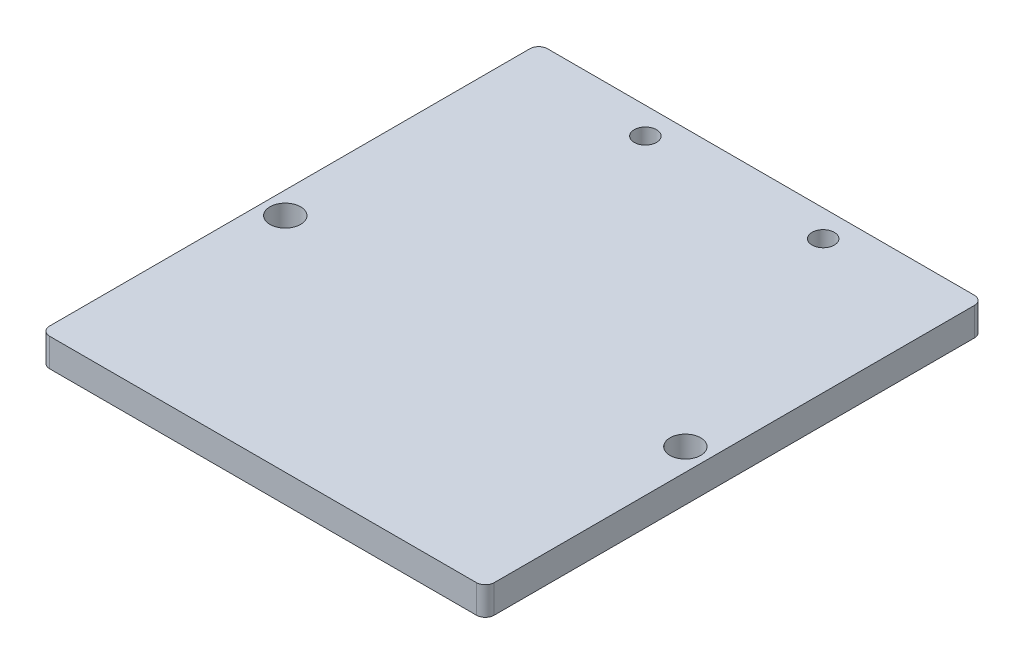
ISO-10303-21;
HEADER;
FILE_DESCRIPTION(('STEP AP214'),'2;1');
FILE_NAME('part.step','',(''),(''),'','','');
FILE_SCHEMA(('AUTOMOTIVE_DESIGN { 1 0 10303 214 1 1 1 1 }'));
ENDSEC;
DATA;
#1=APPLICATION_CONTEXT('core data for automotive mechanical design processes');
#2=APPLICATION_PROTOCOL_DEFINITION('international standard','automotive_design',2000,#1);
#3=PRODUCT_CONTEXT('',#1,'mechanical');
#4=PRODUCT('Part','Part','',(#3));
#5=PRODUCT_RELATED_PRODUCT_CATEGORY('part','',(#4));
#6=PRODUCT_DEFINITION_FORMATION('','',#4);
#7=PRODUCT_DEFINITION_CONTEXT('part definition',#1,'design');
#8=PRODUCT_DEFINITION('design','',#6,#7);
#9=PRODUCT_DEFINITION_SHAPE('','',#8);
#10=(LENGTH_UNIT() NAMED_UNIT(*) SI_UNIT(.MILLI.,.METRE.));
#11=(NAMED_UNIT(*) PLANE_ANGLE_UNIT() SI_UNIT($,.RADIAN.));
#12=(NAMED_UNIT(*) SI_UNIT($,.STERADIAN.) SOLID_ANGLE_UNIT());
#13=UNCERTAINTY_MEASURE_WITH_UNIT(LENGTH_MEASURE(1.E-05),#10,'distance_accuracy_value','');
#14=(GEOMETRIC_REPRESENTATION_CONTEXT(3) GLOBAL_UNCERTAINTY_ASSIGNED_CONTEXT((#13)) GLOBAL_UNIT_ASSIGNED_CONTEXT((#10,
#11,#12)) REPRESENTATION_CONTEXT('',''));
#15=CARTESIAN_POINT('',(0.,0.,0.));
#16=DIRECTION('',(0.,0.,1.));
#17=DIRECTION('',(1.,0.,0.));
#18=AXIS2_PLACEMENT_3D('',#15,#16,#17);
#19=CARTESIAN_POINT('',(0.,3.175,0.));
#20=DIRECTION('',(0.,1.,0.));
#21=DIRECTION('',(0.,0.,1.));
#22=AXIS2_PLACEMENT_3D('',#19,#20,#21);
#23=PLANE('',#22);
#24=CARTESIAN_POINT('',(2.5,3.175,31.));
#25=DIRECTION('',(0.,1.,0.));
#26=DIRECTION('',(0.,0.,1.));
#27=AXIS2_PLACEMENT_3D('',#24,#25,#26);
#28=CIRCLE('',#27,1.725);
#29=CARTESIAN_POINT('',(2.5,3.175,32.725));
#30=VERTEX_POINT('',#29);
#31=EDGE_CURVE('E226',#30,#30,#28,.T.);
#32=ORIENTED_EDGE('',*,*,#31,.F.);
#33=EDGE_LOOP('',(#32));
#34=FACE_BOUND('',#33,.T.);
#35=CARTESIAN_POINT('',(47.5,3.175,31.));
#36=DIRECTION('',(0.,1.,0.));
#37=DIRECTION('',(0.,0.,1.));
#38=AXIS2_PLACEMENT_3D('',#35,#36,#37);
#39=CIRCLE('',#38,1.725);
#40=CARTESIAN_POINT('',(47.5,3.175,32.725));
#41=VERTEX_POINT('',#40);
#42=EDGE_CURVE('E222',#41,#41,#39,.T.);
#43=ORIENTED_EDGE('',*,*,#42,.F.);
#44=EDGE_LOOP('',(#43));
#45=FACE_BOUND('',#44,.T.);
#46=CARTESIAN_POINT('',(15.,3.175,3.));
#47=DIRECTION('',(0.,1.,0.));
#48=DIRECTION('',(0.,0.,1.));
#49=AXIS2_PLACEMENT_3D('',#46,#47,#48);
#50=CIRCLE('',#49,1.25);
#51=CARTESIAN_POINT('',(15.,3.175,4.25));
#52=VERTEX_POINT('',#51);
#53=EDGE_CURVE('E213',#52,#52,#50,.T.);
#54=ORIENTED_EDGE('',*,*,#53,.F.);
#55=EDGE_LOOP('',(#54));
#56=FACE_BOUND('',#55,.T.);
#57=CARTESIAN_POINT('',(35.,3.175,3.));
#58=DIRECTION('',(0.,1.,0.));
#59=DIRECTION('',(0.,0.,1.));
#60=AXIS2_PLACEMENT_3D('',#57,#58,#59);
#61=CIRCLE('',#60,1.25);
#62=CARTESIAN_POINT('',(35.,3.175,4.25));
#63=VERTEX_POINT('',#62);
#64=EDGE_CURVE('E205',#63,#63,#61,.T.);
#65=ORIENTED_EDGE('',*,*,#64,.F.);
#66=EDGE_LOOP('',(#65));
#67=FACE_BOUND('',#66,.T.);
#68=DIRECTION('',(0.,0.,1.));
#69=VECTOR('',#68,1.);
#70=CARTESIAN_POINT('',(0.,3.175,0.));
#71=LINE('',#70,#69);
#72=CARTESIAN_POINT('',(0.,3.175,1.));
#73=VERTEX_POINT('',#72);
#74=CARTESIAN_POINT('',(0.,3.175,55.));
#75=VERTEX_POINT('',#74);
#76=EDGE_CURVE('E157',#73,#75,#71,.T.);
#77=ORIENTED_EDGE('',*,*,#76,.T.);
#78=CARTESIAN_POINT('',(1.00000000000001,3.175,55.));
#79=DIRECTION('',(0.,1.,0.));
#80=DIRECTION('',(0.,0.,1.));
#81=AXIS2_PLACEMENT_3D('',#78,#79,#80);
#82=CIRCLE('',#81,1.);
#83=CARTESIAN_POINT('',(1.00000000000001,3.175,56.));
#84=VERTEX_POINT('',#83);
#85=EDGE_CURVE('E181',#75,#84,#82,.T.);
#86=ORIENTED_EDGE('',*,*,#85,.T.);
#87=DIRECTION('',(1.,0.,0.));
#88=VECTOR('',#87,1.);
#89=CARTESIAN_POINT('',(0.,3.175,56.));
#90=LINE('',#89,#88);
#91=CARTESIAN_POINT('',(49.,3.175,56.));
#92=VERTEX_POINT('',#91);
#93=EDGE_CURVE('E135',#84,#92,#90,.T.);
#94=ORIENTED_EDGE('',*,*,#93,.T.);
#95=CARTESIAN_POINT('',(49.,3.175,55.));
#96=DIRECTION('',(0.,1.,0.));
#97=DIRECTION('',(0.,0.,1.));
#98=AXIS2_PLACEMENT_3D('',#95,#96,#97);
#99=CIRCLE('',#98,1.);
#100=CARTESIAN_POINT('',(50.,3.175,55.));
#101=VERTEX_POINT('',#100);
#102=EDGE_CURVE('E178',#92,#101,#99,.T.);
#103=ORIENTED_EDGE('',*,*,#102,.T.);
#104=DIRECTION('',(0.,0.,-1.));
#105=VECTOR('',#104,1.);
#106=CARTESIAN_POINT('',(50.,3.175,0.));
#107=LINE('',#106,#105);
#108=CARTESIAN_POINT('',(50.,3.175,1.));
#109=VERTEX_POINT('',#108);
#110=EDGE_CURVE('E193',#101,#109,#107,.T.);
#111=ORIENTED_EDGE('',*,*,#110,.T.);
#112=CARTESIAN_POINT('',(49.,3.175,1.));
#113=DIRECTION('',(0.,1.,0.));
#114=DIRECTION('',(0.,0.,1.));
#115=AXIS2_PLACEMENT_3D('',#112,#113,#114);
#116=CIRCLE('',#115,1.);
#117=CARTESIAN_POINT('',(49.,3.175,0.));
#118=VERTEX_POINT('',#117);
#119=EDGE_CURVE('E69',#109,#118,#116,.T.);
#120=ORIENTED_EDGE('',*,*,#119,.T.);
#121=DIRECTION('',(-1.,0.,0.));
#122=VECTOR('',#121,1.);
#123=CARTESIAN_POINT('',(0.,3.175,0.));
#124=LINE('',#123,#122);
#125=CARTESIAN_POINT('',(1.,3.175,0.));
#126=VERTEX_POINT('',#125);
#127=EDGE_CURVE('E159',#118,#126,#124,.T.);
#128=ORIENTED_EDGE('',*,*,#127,.T.);
#129=CARTESIAN_POINT('',(1.,3.175,1.));
#130=DIRECTION('',(0.,1.,0.));
#131=DIRECTION('',(0.,0.,1.));
#132=AXIS2_PLACEMENT_3D('',#129,#130,#131);
#133=CIRCLE('',#132,1.);
#134=EDGE_CURVE('E173',#126,#73,#133,.T.);
#135=ORIENTED_EDGE('',*,*,#134,.T.);
#136=EDGE_LOOP('',(#77,#86,#94,#103,#111,#120,#128,#135));
#137=FACE_BOUND('',#136,.T.);
#138=ADVANCED_FACE('F47',(#34,#45,#56,#67,#137),#23,.T.);
#139=CARTESIAN_POINT('',(0.,0.,0.));
#140=DIRECTION('',(0.,1.,0.));
#141=DIRECTION('',(0.,0.,1.));
#142=AXIS2_PLACEMENT_3D('',#139,#140,#141);
#143=PLANE('',#142);
#144=CARTESIAN_POINT('',(2.5,0.,31.));
#145=DIRECTION('',(0.,1.,0.));
#146=DIRECTION('',(0.,0.,1.));
#147=AXIS2_PLACEMENT_3D('',#144,#145,#146);
#148=CIRCLE('',#147,1.725);
#149=CARTESIAN_POINT('',(2.5,0.,32.725));
#150=VERTEX_POINT('',#149);
#151=EDGE_CURVE('E217',#150,#150,#148,.T.);
#152=ORIENTED_EDGE('',*,*,#151,.T.);
#153=EDGE_LOOP('',(#152));
#154=FACE_BOUND('',#153,.T.);
#155=CARTESIAN_POINT('',(47.5,0.,31.));
#156=DIRECTION('',(0.,1.,0.));
#157=DIRECTION('',(0.,0.,1.));
#158=AXIS2_PLACEMENT_3D('',#155,#156,#157);
#159=CIRCLE('',#158,1.725);
#160=CARTESIAN_POINT('',(47.5,0.,32.725));
#161=VERTEX_POINT('',#160);
#162=EDGE_CURVE('E218',#161,#161,#159,.T.);
#163=ORIENTED_EDGE('',*,*,#162,.T.);
#164=EDGE_LOOP('',(#163));
#165=FACE_BOUND('',#164,.T.);
#166=CARTESIAN_POINT('',(15.,0.,3.));
#167=DIRECTION('',(0.,1.,0.));
#168=DIRECTION('',(0.,0.,1.));
#169=AXIS2_PLACEMENT_3D('',#166,#167,#168);
#170=CIRCLE('',#169,1.25);
#171=CARTESIAN_POINT('',(15.,0.,4.25));
#172=VERTEX_POINT('',#171);
#173=EDGE_CURVE('E209',#172,#172,#170,.T.);
#174=ORIENTED_EDGE('',*,*,#173,.T.);
#175=EDGE_LOOP('',(#174));
#176=FACE_BOUND('',#175,.T.);
#177=CARTESIAN_POINT('',(35.,0.,3.));
#178=DIRECTION('',(0.,1.,0.));
#179=DIRECTION('',(0.,0.,1.));
#180=AXIS2_PLACEMENT_3D('',#177,#178,#179);
#181=CIRCLE('',#180,1.25);
#182=CARTESIAN_POINT('',(35.,0.,4.25));
#183=VERTEX_POINT('',#182);
#184=EDGE_CURVE('E151',#183,#183,#181,.T.);
#185=ORIENTED_EDGE('',*,*,#184,.T.);
#186=EDGE_LOOP('',(#185));
#187=FACE_BOUND('',#186,.T.);
#188=DIRECTION('',(1.,0.,0.));
#189=VECTOR('',#188,1.);
#190=CARTESIAN_POINT('',(0.,0.,56.));
#191=LINE('',#190,#189);
#192=CARTESIAN_POINT('',(1.00000000000001,0.,56.));
#193=VERTEX_POINT('',#192);
#194=CARTESIAN_POINT('',(49.,0.,56.));
#195=VERTEX_POINT('',#194);
#196=EDGE_CURVE('E132',#193,#195,#191,.T.);
#197=ORIENTED_EDGE('',*,*,#196,.F.);
#198=CARTESIAN_POINT('',(1.00000000000001,0.,55.));
#199=DIRECTION('',(0.,1.,0.));
#200=DIRECTION('',(0.,0.,1.));
#201=AXIS2_PLACEMENT_3D('',#198,#199,#200);
#202=CIRCLE('',#201,1.);
#203=CARTESIAN_POINT('',(0.,0.,55.));
#204=VERTEX_POINT('',#203);
#205=EDGE_CURVE('E114',#193,#204,#202,.F.);
#206=ORIENTED_EDGE('',*,*,#205,.T.);
#207=DIRECTION('',(0.,0.,1.));
#208=VECTOR('',#207,1.);
#209=CARTESIAN_POINT('',(0.,0.,0.));
#210=LINE('',#209,#208);
#211=CARTESIAN_POINT('',(0.,0.,1.));
#212=VERTEX_POINT('',#211);
#213=EDGE_CURVE('E144',#212,#204,#210,.T.);
#214=ORIENTED_EDGE('',*,*,#213,.F.);
#215=CARTESIAN_POINT('',(1.,0.,1.));
#216=DIRECTION('',(0.,1.,0.));
#217=DIRECTION('',(0.,0.,1.));
#218=AXIS2_PLACEMENT_3D('',#215,#216,#217);
#219=CIRCLE('',#218,1.);
#220=CARTESIAN_POINT('',(1.,0.,0.));
#221=VERTEX_POINT('',#220);
#222=EDGE_CURVE('E137',#212,#221,#219,.F.);
#223=ORIENTED_EDGE('',*,*,#222,.T.);
#224=DIRECTION('',(-1.,0.,0.));
#225=VECTOR('',#224,1.);
#226=CARTESIAN_POINT('',(0.,0.,0.));
#227=LINE('',#226,#225);
#228=CARTESIAN_POINT('',(49.,0.,0.));
#229=VERTEX_POINT('',#228);
#230=EDGE_CURVE('E149',#229,#221,#227,.T.);
#231=ORIENTED_EDGE('',*,*,#230,.F.);
#232=CARTESIAN_POINT('',(49.,0.,1.));
#233=DIRECTION('',(0.,1.,0.));
#234=DIRECTION('',(0.,0.,1.));
#235=AXIS2_PLACEMENT_3D('',#232,#233,#234);
#236=CIRCLE('',#235,1.);
#237=CARTESIAN_POINT('',(50.,0.,1.));
#238=VERTEX_POINT('',#237);
#239=EDGE_CURVE('E163',#229,#238,#236,.F.);
#240=ORIENTED_EDGE('',*,*,#239,.T.);
#241=DIRECTION('',(0.,0.,-1.));
#242=VECTOR('',#241,1.);
#243=CARTESIAN_POINT('',(50.,0.,0.));
#244=LINE('',#243,#242);
#245=CARTESIAN_POINT('',(50.,0.,55.));
#246=VERTEX_POINT('',#245);
#247=EDGE_CURVE('E143',#246,#238,#244,.T.);
#248=ORIENTED_EDGE('',*,*,#247,.F.);
#249=CARTESIAN_POINT('',(49.,0.,55.));
#250=DIRECTION('',(0.,1.,0.));
#251=DIRECTION('',(0.,0.,1.));
#252=AXIS2_PLACEMENT_3D('',#249,#250,#251);
#253=CIRCLE('',#252,1.);
#254=EDGE_CURVE('E126',#246,#195,#253,.F.);
#255=ORIENTED_EDGE('',*,*,#254,.T.);
#256=EDGE_LOOP('',(#197,#206,#214,#223,#231,#240,#248,#255));
#257=FACE_BOUND('',#256,.T.);
#258=ADVANCED_FACE('F140',(#154,#165,#176,#187,#257),#143,.F.);
#259=CARTESIAN_POINT('',(0.,3.175,0.));
#260=DIRECTION('',(1.,0.,0.));
#261=DIRECTION('',(0.,0.,-1.));
#262=AXIS2_PLACEMENT_3D('',#259,#260,#261);
#263=PLANE('',#262);
#264=ORIENTED_EDGE('',*,*,#213,.T.);
#265=DIRECTION('',(0.,-1.,0.));
#266=VECTOR('',#265,1.);
#267=CARTESIAN_POINT('',(0.,3.175,55.));
#268=LINE('',#267,#266);
#269=EDGE_CURVE('E119',#204,#75,#268,.F.);
#270=ORIENTED_EDGE('',*,*,#269,.T.);
#271=ORIENTED_EDGE('',*,*,#76,.F.);
#272=DIRECTION('',(0.,-1.,0.));
#273=VECTOR('',#272,1.);
#274=CARTESIAN_POINT('',(0.,3.175,1.));
#275=LINE('',#274,#273);
#276=EDGE_CURVE('E125',#73,#212,#275,.T.);
#277=ORIENTED_EDGE('',*,*,#276,.T.);
#278=EDGE_LOOP('',(#264,#270,#271,#277));
#279=FACE_BOUND('',#278,.T.);
#280=ADVANCED_FACE('F270',(#279),#263,.F.);
#281=CARTESIAN_POINT('',(0.,3.175,56.));
#282=DIRECTION('',(0.,0.,-1.));
#283=DIRECTION('',(-1.,0.,0.));
#284=AXIS2_PLACEMENT_3D('',#281,#282,#283);
#285=PLANE('',#284);
#286=ORIENTED_EDGE('',*,*,#93,.F.);
#287=DIRECTION('',(0.,-1.,0.));
#288=VECTOR('',#287,1.);
#289=CARTESIAN_POINT('',(1.00000000000001,3.175,56.));
#290=LINE('',#289,#288);
#291=EDGE_CURVE('E118',#84,#193,#290,.T.);
#292=ORIENTED_EDGE('',*,*,#291,.T.);
#293=ORIENTED_EDGE('',*,*,#196,.T.);
#294=DIRECTION('',(0.,-1.,0.));
#295=VECTOR('',#294,1.);
#296=CARTESIAN_POINT('',(49.,3.175,56.));
#297=LINE('',#296,#295);
#298=EDGE_CURVE('E138',#195,#92,#297,.F.);
#299=ORIENTED_EDGE('',*,*,#298,.T.);
#300=EDGE_LOOP('',(#286,#292,#293,#299));
#301=FACE_BOUND('',#300,.T.);
#302=ADVANCED_FACE('F131',(#301),#285,.F.);
#303=CARTESIAN_POINT('',(50.,3.175,0.));
#304=DIRECTION('',(-1.,0.,0.));
#305=DIRECTION('',(0.,0.,1.));
#306=AXIS2_PLACEMENT_3D('',#303,#304,#305);
#307=PLANE('',#306);
#308=ORIENTED_EDGE('',*,*,#110,.F.);
#309=DIRECTION('',(0.,-1.,0.));
#310=VECTOR('',#309,1.);
#311=CARTESIAN_POINT('',(50.,3.175,55.));
#312=LINE('',#311,#310);
#313=EDGE_CURVE('E187',#101,#246,#312,.T.);
#314=ORIENTED_EDGE('',*,*,#313,.T.);
#315=ORIENTED_EDGE('',*,*,#247,.T.);
#316=DIRECTION('',(0.,-1.,0.));
#317=VECTOR('',#316,1.);
#318=CARTESIAN_POINT('',(50.,3.175,1.));
#319=LINE('',#318,#317);
#320=EDGE_CURVE('E184',#238,#109,#319,.F.);
#321=ORIENTED_EDGE('',*,*,#320,.T.);
#322=EDGE_LOOP('',(#308,#314,#315,#321));
#323=FACE_BOUND('',#322,.T.);
#324=ADVANCED_FACE('F274',(#323),#307,.F.);
#325=CARTESIAN_POINT('',(0.,3.175,0.));
#326=DIRECTION('',(0.,0.,1.));
#327=DIRECTION('',(1.,0.,0.));
#328=AXIS2_PLACEMENT_3D('',#325,#326,#327);
#329=PLANE('',#328);
#330=ORIENTED_EDGE('',*,*,#127,.F.);
#331=DIRECTION('',(0.,-1.,0.));
#332=VECTOR('',#331,1.);
#333=CARTESIAN_POINT('',(49.,3.175,0.));
#334=LINE('',#333,#332);
#335=EDGE_CURVE('E11',#118,#229,#334,.T.);
#336=ORIENTED_EDGE('',*,*,#335,.T.);
#337=ORIENTED_EDGE('',*,*,#230,.T.);
#338=DIRECTION('',(0.,-1.,0.));
#339=VECTOR('',#338,1.);
#340=CARTESIAN_POINT('',(1.,3.175,0.));
#341=LINE('',#340,#339);
#342=EDGE_CURVE('E56',#221,#126,#341,.F.);
#343=ORIENTED_EDGE('',*,*,#342,.T.);
#344=EDGE_LOOP('',(#330,#336,#337,#343));
#345=FACE_BOUND('',#344,.T.);
#346=ADVANCED_FACE('F271',(#345),#329,.F.);
#347=CARTESIAN_POINT('',(1.00000000000001,3.175,55.));
#348=DIRECTION('',(0.,-1.,0.));
#349=DIRECTION('',(0.,0.,-1.));
#350=AXIS2_PLACEMENT_3D('',#347,#348,#349);
#351=CYLINDRICAL_SURFACE('',#350,1.);
#352=ORIENTED_EDGE('',*,*,#85,.F.);
#353=ORIENTED_EDGE('',*,*,#269,.F.);
#354=ORIENTED_EDGE('',*,*,#205,.F.);
#355=ORIENTED_EDGE('',*,*,#291,.F.);
#356=EDGE_LOOP('',(#352,#353,#354,#355));
#357=FACE_BOUND('',#356,.T.);
#358=ADVANCED_FACE('F117',(#357),#351,.T.);
#359=CARTESIAN_POINT('',(49.,3.175,55.));
#360=DIRECTION('',(0.,-1.,0.));
#361=DIRECTION('',(0.,0.,-1.));
#362=AXIS2_PLACEMENT_3D('',#359,#360,#361);
#363=CYLINDRICAL_SURFACE('',#362,1.);
#364=ORIENTED_EDGE('',*,*,#102,.F.);
#365=ORIENTED_EDGE('',*,*,#298,.F.);
#366=ORIENTED_EDGE('',*,*,#254,.F.);
#367=ORIENTED_EDGE('',*,*,#313,.F.);
#368=EDGE_LOOP('',(#364,#365,#366,#367));
#369=FACE_BOUND('',#368,.T.);
#370=ADVANCED_FACE('F285',(#369),#363,.T.);
#371=CARTESIAN_POINT('',(49.,3.175,1.));
#372=DIRECTION('',(0.,-1.,0.));
#373=DIRECTION('',(0.,0.,-1.));
#374=AXIS2_PLACEMENT_3D('',#371,#372,#373);
#375=CYLINDRICAL_SURFACE('',#374,1.);
#376=ORIENTED_EDGE('',*,*,#119,.F.);
#377=ORIENTED_EDGE('',*,*,#320,.F.);
#378=ORIENTED_EDGE('',*,*,#239,.F.);
#379=ORIENTED_EDGE('',*,*,#335,.F.);
#380=EDGE_LOOP('',(#376,#377,#378,#379));
#381=FACE_BOUND('',#380,.T.);
#382=ADVANCED_FACE('F263',(#381),#375,.T.);
#383=CARTESIAN_POINT('',(1.,3.175,1.));
#384=DIRECTION('',(0.,-1.,0.));
#385=DIRECTION('',(0.,0.,-1.));
#386=AXIS2_PLACEMENT_3D('',#383,#384,#385);
#387=CYLINDRICAL_SURFACE('',#386,1.);
#388=ORIENTED_EDGE('',*,*,#134,.F.);
#389=ORIENTED_EDGE('',*,*,#342,.F.);
#390=ORIENTED_EDGE('',*,*,#222,.F.);
#391=ORIENTED_EDGE('',*,*,#276,.F.);
#392=EDGE_LOOP('',(#388,#389,#390,#391));
#393=FACE_BOUND('',#392,.T.);
#394=ADVANCED_FACE('F49',(#393),#387,.T.);
#395=CARTESIAN_POINT('',(35.,3.175,3.));
#396=DIRECTION('',(0.,1.,0.));
#397=DIRECTION('',(0.,0.,1.));
#398=AXIS2_PLACEMENT_3D('',#395,#396,#397);
#399=CYLINDRICAL_SURFACE('',#398,1.25);
#400=ORIENTED_EDGE('',*,*,#184,.F.);
#401=EDGE_LOOP('',(#400));
#402=FACE_BOUND('',#401,.T.);
#403=ORIENTED_EDGE('',*,*,#64,.T.);
#404=EDGE_LOOP('',(#403));
#405=FACE_BOUND('',#404,.T.);
#406=ADVANCED_FACE('F252',(#402,#405),#399,.F.);
#407=CARTESIAN_POINT('',(15.,3.175,3.));
#408=DIRECTION('',(0.,1.,0.));
#409=DIRECTION('',(0.,0.,1.));
#410=AXIS2_PLACEMENT_3D('',#407,#408,#409);
#411=CYLINDRICAL_SURFACE('',#410,1.25);
#412=ORIENTED_EDGE('',*,*,#173,.F.);
#413=EDGE_LOOP('',(#412));
#414=FACE_BOUND('',#413,.T.);
#415=ORIENTED_EDGE('',*,*,#53,.T.);
#416=EDGE_LOOP('',(#415));
#417=FACE_BOUND('',#416,.T.);
#418=ADVANCED_FACE('F254',(#414,#417),#411,.F.);
#419=CARTESIAN_POINT('',(47.5,0.,31.));
#420=DIRECTION('',(0.,1.,0.));
#421=DIRECTION('',(0.,0.,1.));
#422=AXIS2_PLACEMENT_3D('',#419,#420,#421);
#423=CYLINDRICAL_SURFACE('',#422,1.725);
#424=ORIENTED_EDGE('',*,*,#162,.F.);
#425=EDGE_LOOP('',(#424));
#426=FACE_BOUND('',#425,.T.);
#427=ORIENTED_EDGE('',*,*,#42,.T.);
#428=EDGE_LOOP('',(#427));
#429=FACE_BOUND('',#428,.T.);
#430=ADVANCED_FACE('F239',(#426,#429),#423,.F.);
#431=CARTESIAN_POINT('',(2.5,0.,31.));
#432=DIRECTION('',(0.,1.,0.));
#433=DIRECTION('',(0.,0.,1.));
#434=AXIS2_PLACEMENT_3D('',#431,#432,#433);
#435=CYLINDRICAL_SURFACE('',#434,1.725);
#436=ORIENTED_EDGE('',*,*,#151,.F.);
#437=EDGE_LOOP('',(#436));
#438=FACE_BOUND('',#437,.T.);
#439=ORIENTED_EDGE('',*,*,#31,.T.);
#440=EDGE_LOOP('',(#439));
#441=FACE_BOUND('',#440,.T.);
#442=ADVANCED_FACE('F236',(#438,#441),#435,.F.);
#443=CLOSED_SHELL('',(#138,#258,#280,#302,#324,#346,#358,#370,#382,#394,#406,#418,#430,#442));
#444=MANIFOLD_SOLID_BREP('B2',#443);
#445=ADVANCED_BREP_SHAPE_REPRESENTATION('',(#18,#444),#14);
#446=SHAPE_DEFINITION_REPRESENTATION(#9,#445);
ENDSEC;
END-ISO-10303-21;
